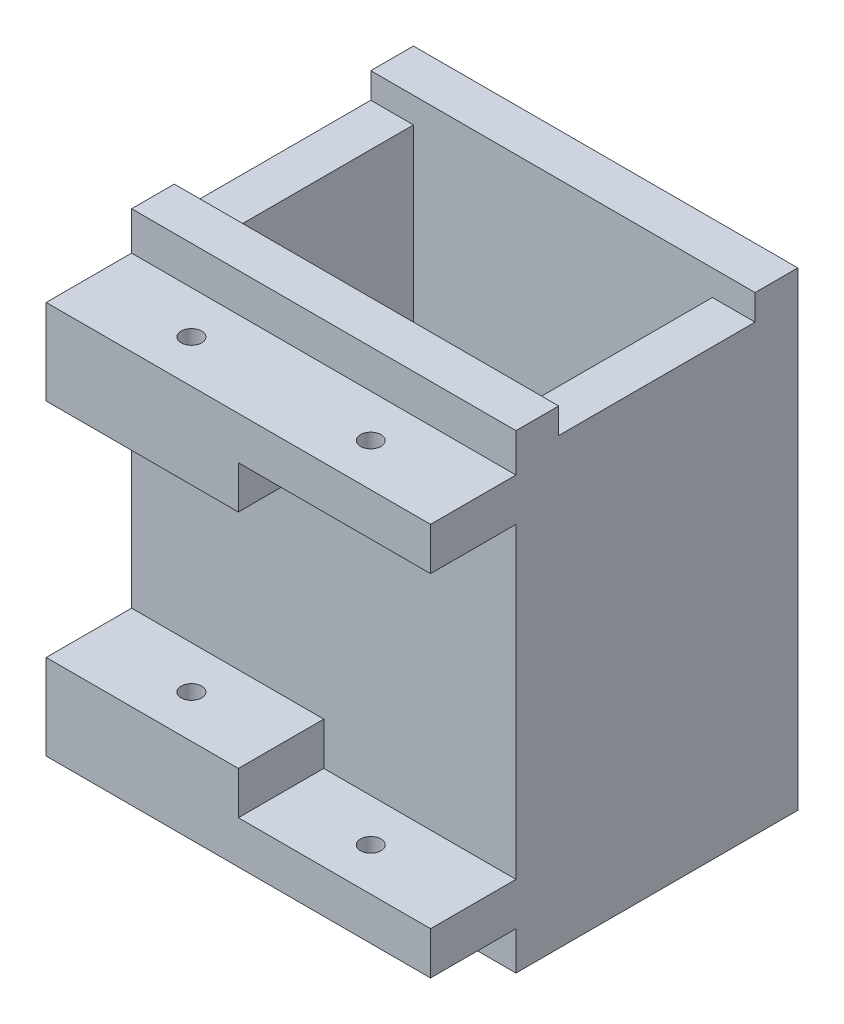
ISO-10303-21;
HEADER;
FILE_DESCRIPTION(('STEP AP214'),'2;1');
FILE_NAME('part.step','',(''),(''),'','','');
FILE_SCHEMA(('AUTOMOTIVE_DESIGN { 1 0 10303 214 1 1 1 1 }'));
ENDSEC;
DATA;
#1=APPLICATION_CONTEXT('core data for automotive mechanical design processes');
#2=APPLICATION_PROTOCOL_DEFINITION('international standard','automotive_design',2000,#1);
#3=PRODUCT_CONTEXT('',#1,'mechanical');
#4=PRODUCT('Part','Part','',(#3));
#5=PRODUCT_RELATED_PRODUCT_CATEGORY('part','',(#4));
#6=PRODUCT_DEFINITION_FORMATION('','',#4);
#7=PRODUCT_DEFINITION_CONTEXT('part definition',#1,'design');
#8=PRODUCT_DEFINITION('design','',#6,#7);
#9=PRODUCT_DEFINITION_SHAPE('','',#8);
#10=(LENGTH_UNIT() NAMED_UNIT(*) SI_UNIT(.MILLI.,.METRE.));
#11=(NAMED_UNIT(*) PLANE_ANGLE_UNIT() SI_UNIT($,.RADIAN.));
#12=(NAMED_UNIT(*) SI_UNIT($,.STERADIAN.) SOLID_ANGLE_UNIT());
#13=UNCERTAINTY_MEASURE_WITH_UNIT(LENGTH_MEASURE(1.E-05),#10,'distance_accuracy_value','');
#14=(GEOMETRIC_REPRESENTATION_CONTEXT(3) GLOBAL_UNCERTAINTY_ASSIGNED_CONTEXT((#13)) GLOBAL_UNIT_ASSIGNED_CONTEXT((#10,
#11,#12)) REPRESENTATION_CONTEXT('',''));
#15=CARTESIAN_POINT('',(0.,0.,0.));
#16=DIRECTION('',(0.,0.,1.));
#17=DIRECTION('',(1.,0.,0.));
#18=AXIS2_PLACEMENT_3D('',#15,#16,#17);
#19=CARTESIAN_POINT('',(-22.5,25.,43.));
#20=DIRECTION('',(0.,-1.,0.));
#21=DIRECTION('',(0.,0.,-1.));
#22=AXIS2_PLACEMENT_3D('',#19,#20,#21);
#23=PLANE('',#22);
#24=DIRECTION('',(0.,0.,-1.));
#25=VECTOR('',#24,1.);
#26=CARTESIAN_POINT('',(22.5,25.,43.));
#27=LINE('',#26,#25);
#28=CARTESIAN_POINT('',(22.5,25.,33.));
#29=VERTEX_POINT('',#28);
#30=CARTESIAN_POINT('',(22.5,25.,28.));
#31=VERTEX_POINT('',#30);
#32=EDGE_CURVE('E11',#29,#31,#27,.T.);
#33=ORIENTED_EDGE('',*,*,#32,.T.);
#34=DIRECTION('',(1.,0.,0.));
#35=VECTOR('',#34,1.);
#36=CARTESIAN_POINT('',(17.5,25.,28.));
#37=LINE('',#36,#35);
#38=CARTESIAN_POINT('',(-22.5,25.,28.));
#39=VERTEX_POINT('',#38);
#40=EDGE_CURVE('E368',#39,#31,#37,.T.);
#41=ORIENTED_EDGE('',*,*,#40,.F.);
#42=DIRECTION('',(0.,0.,-1.));
#43=VECTOR('',#42,1.);
#44=CARTESIAN_POINT('',(-22.5,25.,43.));
#45=LINE('',#44,#43);
#46=CARTESIAN_POINT('',(-22.5,25.,33.));
#47=VERTEX_POINT('',#46);
#48=EDGE_CURVE('E248',#47,#39,#45,.T.);
#49=ORIENTED_EDGE('',*,*,#48,.F.);
#50=DIRECTION('',(1.,0.,0.));
#51=VECTOR('',#50,1.);
#52=CARTESIAN_POINT('',(-22.5,25.,33.));
#53=LINE('',#52,#51);
#54=EDGE_CURVE('E298',#47,#29,#53,.T.);
#55=ORIENTED_EDGE('',*,*,#54,.T.);
#56=EDGE_LOOP('',(#33,#41,#49,#55));
#57=FACE_BOUND('',#56,.T.);
#58=ADVANCED_FACE('F39',(#57),#23,.F.);
#59=CARTESIAN_POINT('',(-22.5,20.5,43.));
#60=DIRECTION('',(0.,-1.,0.));
#61=DIRECTION('',(1.,0.,0.));
#62=AXIS2_PLACEMENT_3D('',#59,#60,#61);
#63=PLANE('',#62);
#64=CARTESIAN_POINT('',(-10.5,20.5,38.));
#65=DIRECTION('',(0.,1.,0.));
#66=DIRECTION('',(0.,0.,1.));
#67=AXIS2_PLACEMENT_3D('',#64,#65,#66);
#68=CIRCLE('',#67,1.19999999999999);
#69=CARTESIAN_POINT('',(-10.5,20.5,39.2));
#70=VERTEX_POINT('',#69);
#71=EDGE_CURVE('E259',#70,#70,#68,.T.);
#72=ORIENTED_EDGE('',*,*,#71,.F.);
#73=EDGE_LOOP('',(#72));
#74=FACE_BOUND('',#73,.T.);
#75=DIRECTION('',(0.,0.,-1.));
#76=VECTOR('',#75,1.);
#77=CARTESIAN_POINT('',(22.5,20.5,43.));
#78=LINE('',#77,#76);
#79=CARTESIAN_POINT('',(22.5,20.5,43.));
#80=VERTEX_POINT('',#79);
#81=CARTESIAN_POINT('',(22.5,20.5,33.));
#82=VERTEX_POINT('',#81);
#83=EDGE_CURVE('E305',#80,#82,#78,.T.);
#84=ORIENTED_EDGE('',*,*,#83,.T.);
#85=DIRECTION('',(1.,0.,0.));
#86=VECTOR('',#85,1.);
#87=CARTESIAN_POINT('',(-22.5,20.5,33.));
#88=LINE('',#87,#86);
#89=CARTESIAN_POINT('',(-22.5,20.5,33.));
#90=VERTEX_POINT('',#89);
#91=EDGE_CURVE('E320',#90,#82,#88,.T.);
#92=ORIENTED_EDGE('',*,*,#91,.F.);
#93=DIRECTION('',(0.,0.,-1.));
#94=VECTOR('',#93,1.);
#95=CARTESIAN_POINT('',(-22.5,20.5,43.));
#96=LINE('',#95,#94);
#97=CARTESIAN_POINT('',(-22.5,20.5,43.));
#98=VERTEX_POINT('',#97);
#99=EDGE_CURVE('E326',#98,#90,#96,.T.);
#100=ORIENTED_EDGE('',*,*,#99,.F.);
#101=DIRECTION('',(1.,0.,0.));
#102=VECTOR('',#101,1.);
#103=CARTESIAN_POINT('',(-22.5,20.5,43.));
#104=LINE('',#103,#102);
#105=EDGE_CURVE('E316',#98,#80,#104,.T.);
#106=ORIENTED_EDGE('',*,*,#105,.T.);
#107=EDGE_LOOP('',(#84,#92,#100,#106));
#108=FACE_BOUND('',#107,.T.);
#109=CARTESIAN_POINT('',(10.5,20.5,38.));
#110=DIRECTION('',(0.,1.,0.));
#111=DIRECTION('',(0.,0.,1.));
#112=AXIS2_PLACEMENT_3D('',#109,#110,#111);
#113=CIRCLE('',#112,1.19999999999999);
#114=CARTESIAN_POINT('',(10.5,20.5,39.2));
#115=VERTEX_POINT('',#114);
#116=EDGE_CURVE('E255',#115,#115,#113,.T.);
#117=ORIENTED_EDGE('',*,*,#116,.F.);
#118=EDGE_LOOP('',(#117));
#119=FACE_BOUND('',#118,.T.);
#120=ADVANCED_FACE('F477',(#74,#108,#119),#63,.F.);
#121=CARTESIAN_POINT('',(0.,0.,43.));
#122=DIRECTION('',(0.,0.,1.));
#123=DIRECTION('',(1.,0.,0.));
#124=AXIS2_PLACEMENT_3D('',#121,#122,#123);
#125=PLANE('',#124);
#126=DIRECTION('',(-1.,0.,0.));
#127=VECTOR('',#126,1.);
#128=CARTESIAN_POINT('',(22.5,15.5,43.));
#129=LINE('',#128,#127);
#130=CARTESIAN_POINT('',(22.5,15.5,43.));
#131=VERTEX_POINT('',#130);
#132=CARTESIAN_POINT('',(0.,15.5,43.));
#133=VERTEX_POINT('',#132);
#134=EDGE_CURVE('E281',#131,#133,#129,.T.);
#135=ORIENTED_EDGE('',*,*,#134,.F.);
#136=DIRECTION('',(0.,1.,0.));
#137=VECTOR('',#136,1.);
#138=CARTESIAN_POINT('',(22.5,25.,43.));
#139=LINE('',#138,#137);
#140=EDGE_CURVE('E230',#131,#80,#139,.T.);
#141=ORIENTED_EDGE('',*,*,#140,.T.);
#142=ORIENTED_EDGE('',*,*,#105,.F.);
#143=DIRECTION('',(0.,-1.,0.));
#144=VECTOR('',#143,1.);
#145=CARTESIAN_POINT('',(-22.5,25.,43.));
#146=LINE('',#145,#144);
#147=CARTESIAN_POINT('',(-22.5,10.5,43.));
#148=VERTEX_POINT('',#147);
#149=EDGE_CURVE('E232',#98,#148,#146,.T.);
#150=ORIENTED_EDGE('',*,*,#149,.T.);
#151=DIRECTION('',(1.,0.,0.));
#152=VECTOR('',#151,1.);
#153=CARTESIAN_POINT('',(-22.5,10.5,43.));
#154=LINE('',#153,#152);
#155=CARTESIAN_POINT('',(0.,10.5,43.));
#156=VERTEX_POINT('',#155);
#157=EDGE_CURVE('E344',#148,#156,#154,.T.);
#158=ORIENTED_EDGE('',*,*,#157,.T.);
#159=DIRECTION('',(0.,-1.,0.));
#160=VECTOR('',#159,1.);
#161=CARTESIAN_POINT('',(0.,15.5,43.));
#162=LINE('',#161,#160);
#163=EDGE_CURVE('E282',#133,#156,#162,.T.);
#164=ORIENTED_EDGE('',*,*,#163,.F.);
#165=EDGE_LOOP('',(#135,#141,#142,#150,#158,#164));
#166=FACE_BOUND('',#165,.T.);
#167=ADVANCED_FACE('F483',(#166),#125,.T.);
#168=CARTESIAN_POINT('',(22.5,25.,43.));
#169=DIRECTION('',(-1.,0.,0.));
#170=DIRECTION('',(0.,-1.,0.));
#171=AXIS2_PLACEMENT_3D('',#168,#169,#170);
#172=PLANE('',#171);
#173=DIRECTION('',(0.,1.,0.));
#174=VECTOR('',#173,1.);
#175=CARTESIAN_POINT('',(22.5,10.5,33.));
#176=LINE('',#175,#174);
#177=CARTESIAN_POINT('',(22.5,-20.5,33.));
#178=VERTEX_POINT('',#177);
#179=CARTESIAN_POINT('',(22.5,15.5,33.));
#180=VERTEX_POINT('',#179);
#181=EDGE_CURVE('E222',#178,#180,#176,.T.);
#182=ORIENTED_EDGE('',*,*,#181,.F.);
#183=DIRECTION('',(0.,0.,1.));
#184=VECTOR('',#183,1.);
#185=CARTESIAN_POINT('',(22.5,-20.5,9.95113885676778));
#186=LINE('',#185,#184);
#187=CARTESIAN_POINT('',(22.5,-20.5,43.));
#188=VERTEX_POINT('',#187);
#189=EDGE_CURVE('E207',#178,#188,#186,.T.);
#190=ORIENTED_EDGE('',*,*,#189,.T.);
#191=CARTESIAN_POINT('',(22.5,-25.5,43.));
#192=VERTEX_POINT('',#191);
#193=EDGE_CURVE('E220',#192,#188,#139,.T.);
#194=ORIENTED_EDGE('',*,*,#193,.F.);
#195=DIRECTION('',(0.,0.,1.));
#196=VECTOR('',#195,1.);
#197=CARTESIAN_POINT('',(22.5,-25.5,33.));
#198=LINE('',#197,#196);
#199=CARTESIAN_POINT('',(22.5,-25.5,33.));
#200=VERTEX_POINT('',#199);
#201=EDGE_CURVE('E306',#200,#192,#198,.T.);
#202=ORIENTED_EDGE('',*,*,#201,.F.);
#203=DIRECTION('',(0.,1.,0.));
#204=VECTOR('',#203,1.);
#205=CARTESIAN_POINT('',(22.5,-25.5,33.));
#206=LINE('',#205,#204);
#207=CARTESIAN_POINT('',(22.5,-30.,33.));
#208=VERTEX_POINT('',#207);
#209=EDGE_CURVE('E308',#208,#200,#206,.T.);
#210=ORIENTED_EDGE('',*,*,#209,.F.);
#211=DIRECTION('',(0.,0.,1.));
#212=VECTOR('',#211,1.);
#213=CARTESIAN_POINT('',(22.5,-30.,43.));
#214=LINE('',#213,#212);
#215=CARTESIAN_POINT('',(22.5,-30.,0.));
#216=VERTEX_POINT('',#215);
#217=EDGE_CURVE('E347',#216,#208,#214,.T.);
#218=ORIENTED_EDGE('',*,*,#217,.F.);
#219=DIRECTION('',(0.,1.,0.));
#220=VECTOR('',#219,1.);
#221=CARTESIAN_POINT('',(22.5,25.,0.));
#222=LINE('',#221,#220);
#223=CARTESIAN_POINT('',(22.5,25.,0.));
#224=VERTEX_POINT('',#223);
#225=EDGE_CURVE('E239',#216,#224,#222,.T.);
#226=ORIENTED_EDGE('',*,*,#225,.T.);
#227=CARTESIAN_POINT('',(22.5,25.,5.));
#228=VERTEX_POINT('',#227);
#229=EDGE_CURVE('E48',#228,#224,#27,.T.);
#230=ORIENTED_EDGE('',*,*,#229,.F.);
#231=DIRECTION('',(0.,1.,0.));
#232=VECTOR('',#231,1.);
#233=CARTESIAN_POINT('',(22.5,22.,5.));
#234=LINE('',#233,#232);
#235=CARTESIAN_POINT('',(22.5,22.,5.));
#236=VERTEX_POINT('',#235);
#237=EDGE_CURVE('E409',#236,#228,#234,.T.);
#238=ORIENTED_EDGE('',*,*,#237,.F.);
#239=DIRECTION('',(0.,0.,-1.));
#240=VECTOR('',#239,1.);
#241=CARTESIAN_POINT('',(22.5,22.,5.));
#242=LINE('',#241,#240);
#243=CARTESIAN_POINT('',(22.5,22.,28.));
#244=VERTEX_POINT('',#243);
#245=EDGE_CURVE('E429',#244,#236,#242,.T.);
#246=ORIENTED_EDGE('',*,*,#245,.F.);
#247=DIRECTION('',(0.,1.,0.));
#248=VECTOR('',#247,1.);
#249=CARTESIAN_POINT('',(22.5,22.,28.));
#250=LINE('',#249,#248);
#251=EDGE_CURVE('E405',#244,#31,#250,.T.);
#252=ORIENTED_EDGE('',*,*,#251,.T.);
#253=ORIENTED_EDGE('',*,*,#32,.F.);
#254=DIRECTION('',(0.,1.,0.));
#255=VECTOR('',#254,1.);
#256=CARTESIAN_POINT('',(22.5,25.,33.));
#257=LINE('',#256,#255);
#258=EDGE_CURVE('E324',#82,#29,#257,.T.);
#259=ORIENTED_EDGE('',*,*,#258,.F.);
#260=ORIENTED_EDGE('',*,*,#83,.F.);
#261=ORIENTED_EDGE('',*,*,#140,.F.);
#262=DIRECTION('',(0.,0.,1.));
#263=VECTOR('',#262,1.);
#264=CARTESIAN_POINT('',(22.5,15.5,9.95113885676778));
#265=LINE('',#264,#263);
#266=EDGE_CURVE('E295',#180,#131,#265,.T.);
#267=ORIENTED_EDGE('',*,*,#266,.F.);
#268=EDGE_LOOP('',(#182,#190,#194,#202,#210,#218,#226,#230,#238,#246,#252,#253,#259,#260,#261,#267));
#269=FACE_BOUND('',#268,.T.);
#270=ADVANCED_FACE('F41',(#269),#172,.F.);
#271=CARTESIAN_POINT('',(-22.5,25.,5.));
#272=VERTEX_POINT('',#271);
#273=CARTESIAN_POINT('',(-22.5,25.,0.));
#274=VERTEX_POINT('',#273);
#275=EDGE_CURVE('E250',#272,#274,#45,.T.);
#276=ORIENTED_EDGE('',*,*,#275,.F.);
#277=DIRECTION('',(-1.,0.,0.));
#278=VECTOR('',#277,1.);
#279=CARTESIAN_POINT('',(17.5,25.,5.));
#280=LINE('',#279,#278);
#281=EDGE_CURVE('E363',#228,#272,#280,.T.);
#282=ORIENTED_EDGE('',*,*,#281,.F.);
#283=ORIENTED_EDGE('',*,*,#229,.T.);
#284=DIRECTION('',(-1.,0.,0.));
#285=VECTOR('',#284,1.);
#286=CARTESIAN_POINT('',(-22.5,25.,0.));
#287=LINE('',#286,#285);
#288=EDGE_CURVE('E242',#224,#274,#287,.T.);
#289=ORIENTED_EDGE('',*,*,#288,.T.);
#290=EDGE_LOOP('',(#276,#282,#283,#289));
#291=FACE_BOUND('',#290,.T.);
#292=ADVANCED_FACE('F463',(#291),#23,.F.);
#293=CARTESIAN_POINT('',(-22.5,25.,43.));
#294=DIRECTION('',(1.,0.,0.));
#295=DIRECTION('',(0.,1.,0.));
#296=AXIS2_PLACEMENT_3D('',#293,#294,#295);
#297=PLANE('',#296);
#298=ORIENTED_EDGE('',*,*,#48,.T.);
#299=DIRECTION('',(0.,1.,0.));
#300=VECTOR('',#299,1.);
#301=CARTESIAN_POINT('',(-22.5,22.,28.));
#302=LINE('',#301,#300);
#303=CARTESIAN_POINT('',(-22.5,22.,28.));
#304=VERTEX_POINT('',#303);
#305=EDGE_CURVE('E414',#304,#39,#302,.T.);
#306=ORIENTED_EDGE('',*,*,#305,.F.);
#307=DIRECTION('',(0.,0.,1.));
#308=VECTOR('',#307,1.);
#309=CARTESIAN_POINT('',(-22.5,22.,5.));
#310=LINE('',#309,#308);
#311=CARTESIAN_POINT('',(-22.5,22.,5.));
#312=VERTEX_POINT('',#311);
#313=EDGE_CURVE('E407',#312,#304,#310,.T.);
#314=ORIENTED_EDGE('',*,*,#313,.F.);
#315=DIRECTION('',(0.,1.,0.));
#316=VECTOR('',#315,1.);
#317=CARTESIAN_POINT('',(-22.5,22.,5.));
#318=LINE('',#317,#316);
#319=EDGE_CURVE('E417',#312,#272,#318,.T.);
#320=ORIENTED_EDGE('',*,*,#319,.T.);
#321=ORIENTED_EDGE('',*,*,#275,.T.);
#322=DIRECTION('',(0.,-1.,0.));
#323=VECTOR('',#322,1.);
#324=CARTESIAN_POINT('',(-22.5,25.,0.));
#325=LINE('',#324,#323);
#326=CARTESIAN_POINT('',(-22.5,-30.,0.));
#327=VERTEX_POINT('',#326);
#328=EDGE_CURVE('E234',#274,#327,#325,.T.);
#329=ORIENTED_EDGE('',*,*,#328,.T.);
#330=DIRECTION('',(0.,0.,-1.));
#331=VECTOR('',#330,1.);
#332=CARTESIAN_POINT('',(-22.5,-30.,43.));
#333=LINE('',#332,#331);
#334=CARTESIAN_POINT('',(-22.5,-30.,33.));
#335=VERTEX_POINT('',#334);
#336=EDGE_CURVE('E358',#335,#327,#333,.T.);
#337=ORIENTED_EDGE('',*,*,#336,.F.);
#338=DIRECTION('',(0.,1.,0.));
#339=VECTOR('',#338,1.);
#340=CARTESIAN_POINT('',(-22.5,-25.5,33.));
#341=LINE('',#340,#339);
#342=CARTESIAN_POINT('',(-22.5,-25.5,33.));
#343=VERTEX_POINT('',#342);
#344=EDGE_CURVE('E309',#335,#343,#341,.T.);
#345=ORIENTED_EDGE('',*,*,#344,.T.);
#346=DIRECTION('',(0.,0.,1.));
#347=VECTOR('',#346,1.);
#348=CARTESIAN_POINT('',(-22.5,-25.5,33.));
#349=LINE('',#348,#347);
#350=CARTESIAN_POINT('',(-22.5,-25.5,43.));
#351=VERTEX_POINT('',#350);
#352=EDGE_CURVE('E301',#343,#351,#349,.T.);
#353=ORIENTED_EDGE('',*,*,#352,.T.);
#354=CARTESIAN_POINT('',(-22.5,-15.5,43.));
#355=VERTEX_POINT('',#354);
#356=EDGE_CURVE('E229',#355,#351,#146,.T.);
#357=ORIENTED_EDGE('',*,*,#356,.F.);
#358=DIRECTION('',(0.,0.,-1.));
#359=VECTOR('',#358,1.);
#360=CARTESIAN_POINT('',(-22.5,-15.5,43.));
#361=LINE('',#360,#359);
#362=CARTESIAN_POINT('',(-22.5,-15.5,33.));
#363=VERTEX_POINT('',#362);
#364=EDGE_CURVE('E333',#355,#363,#361,.T.);
#365=ORIENTED_EDGE('',*,*,#364,.T.);
#366=DIRECTION('',(0.,1.,0.));
#367=VECTOR('',#366,1.);
#368=CARTESIAN_POINT('',(-22.5,10.5,33.));
#369=LINE('',#368,#367);
#370=CARTESIAN_POINT('',(-22.5,10.5,33.));
#371=VERTEX_POINT('',#370);
#372=EDGE_CURVE('E336',#363,#371,#369,.T.);
#373=ORIENTED_EDGE('',*,*,#372,.T.);
#374=DIRECTION('',(0.,0.,1.));
#375=VECTOR('',#374,1.);
#376=CARTESIAN_POINT('',(-22.5,10.5,43.));
#377=LINE('',#376,#375);
#378=EDGE_CURVE('E339',#371,#148,#377,.T.);
#379=ORIENTED_EDGE('',*,*,#378,.T.);
#380=ORIENTED_EDGE('',*,*,#149,.F.);
#381=ORIENTED_EDGE('',*,*,#99,.T.);
#382=DIRECTION('',(0.,1.,0.));
#383=VECTOR('',#382,1.);
#384=CARTESIAN_POINT('',(-22.5,25.,33.));
#385=LINE('',#384,#383);
#386=EDGE_CURVE('E319',#90,#47,#385,.T.);
#387=ORIENTED_EDGE('',*,*,#386,.T.);
#388=EDGE_LOOP('',(#298,#306,#314,#320,#321,#329,#337,#345,#353,#357,#365,#373,#379,#380,#381,#387));
#389=FACE_BOUND('',#388,.T.);
#390=ADVANCED_FACE('F443',(#389),#297,.F.);
#391=DIRECTION('',(0.,-1.,0.));
#392=VECTOR('',#391,1.);
#393=CARTESIAN_POINT('',(0.,-15.5,43.));
#394=LINE('',#393,#392);
#395=CARTESIAN_POINT('',(0.,-15.5,43.));
#396=VERTEX_POINT('',#395);
#397=CARTESIAN_POINT('',(0.,-20.5,43.));
#398=VERTEX_POINT('',#397);
#399=EDGE_CURVE('E215',#396,#398,#394,.T.);
#400=ORIENTED_EDGE('',*,*,#399,.F.);
#401=DIRECTION('',(1.,0.,0.));
#402=VECTOR('',#401,1.);
#403=CARTESIAN_POINT('',(-22.5,-15.5,43.));
#404=LINE('',#403,#402);
#405=EDGE_CURVE('E342',#355,#396,#404,.T.);
#406=ORIENTED_EDGE('',*,*,#405,.F.);
#407=ORIENTED_EDGE('',*,*,#356,.T.);
#408=DIRECTION('',(1.,0.,0.));
#409=VECTOR('',#408,1.);
#410=CARTESIAN_POINT('',(-22.5,-25.5,43.));
#411=LINE('',#410,#409);
#412=EDGE_CURVE('E228',#351,#192,#411,.T.);
#413=ORIENTED_EDGE('',*,*,#412,.T.);
#414=ORIENTED_EDGE('',*,*,#193,.T.);
#415=DIRECTION('',(1.,0.,0.));
#416=VECTOR('',#415,1.);
#417=CARTESIAN_POINT('',(22.5,-20.5,43.));
#418=LINE('',#417,#416);
#419=EDGE_CURVE('E203',#398,#188,#418,.T.);
#420=ORIENTED_EDGE('',*,*,#419,.F.);
#421=EDGE_LOOP('',(#400,#406,#407,#413,#414,#420));
#422=FACE_BOUND('',#421,.T.);
#423=ADVANCED_FACE('F226',(#422),#125,.T.);
#424=CARTESIAN_POINT('',(0.,0.,0.));
#425=DIRECTION('',(0.,0.,1.));
#426=DIRECTION('',(1.,0.,0.));
#427=AXIS2_PLACEMENT_3D('',#424,#425,#426);
#428=PLANE('',#427);
#429=ORIENTED_EDGE('',*,*,#225,.F.);
#430=DIRECTION('',(1.,0.,0.));
#431=VECTOR('',#430,1.);
#432=CARTESIAN_POINT('',(22.5,-30.,0.));
#433=LINE('',#432,#431);
#434=EDGE_CURVE('E360',#327,#216,#433,.T.);
#435=ORIENTED_EDGE('',*,*,#434,.F.);
#436=ORIENTED_EDGE('',*,*,#328,.F.);
#437=ORIENTED_EDGE('',*,*,#288,.F.);
#438=EDGE_LOOP('',(#429,#435,#436,#437));
#439=FACE_BOUND('',#438,.T.);
#440=ADVANCED_FACE('F457',(#439),#428,.F.);
#441=CARTESIAN_POINT('',(17.5,-25.,5.));
#442=DIRECTION('',(1.,0.,0.));
#443=DIRECTION('',(0.,0.,-1.));
#444=AXIS2_PLACEMENT_3D('',#441,#442,#443);
#445=PLANE('',#444);
#446=DIRECTION('',(0.,1.,0.));
#447=VECTOR('',#446,1.);
#448=CARTESIAN_POINT('',(17.5,-25.,28.));
#449=LINE('',#448,#447);
#450=CARTESIAN_POINT('',(17.5,-25.,28.));
#451=VERTEX_POINT('',#450);
#452=CARTESIAN_POINT('',(17.5,22.,28.));
#453=VERTEX_POINT('',#452);
#454=EDGE_CURVE('E243',#451,#453,#449,.T.);
#455=ORIENTED_EDGE('',*,*,#454,.T.);
#456=DIRECTION('',(0.,0.,-1.));
#457=VECTOR('',#456,1.);
#458=CARTESIAN_POINT('',(17.5,22.,5.));
#459=LINE('',#458,#457);
#460=CARTESIAN_POINT('',(17.5,22.,5.));
#461=VERTEX_POINT('',#460);
#462=EDGE_CURVE('E266',#453,#461,#459,.T.);
#463=ORIENTED_EDGE('',*,*,#462,.T.);
#464=DIRECTION('',(0.,1.,0.));
#465=VECTOR('',#464,1.);
#466=CARTESIAN_POINT('',(17.5,-25.,5.));
#467=LINE('',#466,#465);
#468=CARTESIAN_POINT('',(17.5,-25.,5.));
#469=VERTEX_POINT('',#468);
#470=EDGE_CURVE('E236',#469,#461,#467,.T.);
#471=ORIENTED_EDGE('',*,*,#470,.F.);
#472=DIRECTION('',(0.,0.,-1.));
#473=VECTOR('',#472,1.);
#474=CARTESIAN_POINT('',(17.5,-25.,5.));
#475=LINE('',#474,#473);
#476=EDGE_CURVE('E364',#451,#469,#475,.T.);
#477=ORIENTED_EDGE('',*,*,#476,.F.);
#478=EDGE_LOOP('',(#455,#463,#471,#477));
#479=FACE_BOUND('',#478,.T.);
#480=ADVANCED_FACE('F396',(#479),#445,.F.);
#481=CARTESIAN_POINT('',(17.5,-25.,28.));
#482=DIRECTION('',(0.,0.,1.));
#483=DIRECTION('',(1.,0.,0.));
#484=AXIS2_PLACEMENT_3D('',#481,#482,#483);
#485=PLANE('',#484);
#486=DIRECTION('',(0.,1.,0.));
#487=VECTOR('',#486,1.);
#488=CARTESIAN_POINT('',(-17.5,-25.,28.));
#489=LINE('',#488,#487);
#490=CARTESIAN_POINT('',(-17.5,-25.,28.));
#491=VERTEX_POINT('',#490);
#492=CARTESIAN_POINT('',(-17.5,22.,28.));
#493=VERTEX_POINT('',#492);
#494=EDGE_CURVE('E381',#491,#493,#489,.T.);
#495=ORIENTED_EDGE('',*,*,#494,.T.);
#496=DIRECTION('',(1.,0.,0.));
#497=VECTOR('',#496,1.);
#498=CARTESIAN_POINT('',(22.5,22.,28.));
#499=LINE('',#498,#497);
#500=EDGE_CURVE('E64',#304,#493,#499,.T.);
#501=ORIENTED_EDGE('',*,*,#500,.F.);
#502=ORIENTED_EDGE('',*,*,#305,.T.);
#503=ORIENTED_EDGE('',*,*,#40,.T.);
#504=ORIENTED_EDGE('',*,*,#251,.F.);
#505=EDGE_CURVE('E400',#453,#244,#499,.T.);
#506=ORIENTED_EDGE('',*,*,#505,.F.);
#507=ORIENTED_EDGE('',*,*,#454,.F.);
#508=DIRECTION('',(1.,0.,0.));
#509=VECTOR('',#508,1.);
#510=CARTESIAN_POINT('',(17.5,-25.,28.));
#511=LINE('',#510,#509);
#512=EDGE_CURVE('E374',#491,#451,#511,.T.);
#513=ORIENTED_EDGE('',*,*,#512,.F.);
#514=EDGE_LOOP('',(#495,#501,#502,#503,#504,#506,#507,#513));
#515=FACE_BOUND('',#514,.T.);
#516=ADVANCED_FACE('F403',(#515),#485,.F.);
#517=CARTESIAN_POINT('',(-17.5,-25.,5.));
#518=DIRECTION('',(-1.,0.,0.));
#519=DIRECTION('',(0.,0.,1.));
#520=AXIS2_PLACEMENT_3D('',#517,#518,#519);
#521=PLANE('',#520);
#522=DIRECTION('',(0.,1.,0.));
#523=VECTOR('',#522,1.);
#524=CARTESIAN_POINT('',(-17.5,-25.,5.));
#525=LINE('',#524,#523);
#526=CARTESIAN_POINT('',(-17.5,-25.,5.));
#527=VERTEX_POINT('',#526);
#528=CARTESIAN_POINT('',(-17.5,22.,5.));
#529=VERTEX_POINT('',#528);
#530=EDGE_CURVE('E383',#527,#529,#525,.T.);
#531=ORIENTED_EDGE('',*,*,#530,.T.);
#532=DIRECTION('',(0.,0.,1.));
#533=VECTOR('',#532,1.);
#534=CARTESIAN_POINT('',(-17.5,22.,5.));
#535=LINE('',#534,#533);
#536=EDGE_CURVE('E271',#529,#493,#535,.T.);
#537=ORIENTED_EDGE('',*,*,#536,.T.);
#538=ORIENTED_EDGE('',*,*,#494,.F.);
#539=DIRECTION('',(0.,0.,1.));
#540=VECTOR('',#539,1.);
#541=CARTESIAN_POINT('',(-17.5,-25.,5.));
#542=LINE('',#541,#540);
#543=EDGE_CURVE('E371',#527,#491,#542,.T.);
#544=ORIENTED_EDGE('',*,*,#543,.F.);
#545=EDGE_LOOP('',(#531,#537,#538,#544));
#546=FACE_BOUND('',#545,.T.);
#547=ADVANCED_FACE('F421',(#546),#521,.F.);
#548=CARTESIAN_POINT('',(17.5,-25.,5.));
#549=DIRECTION('',(0.,0.,-1.));
#550=DIRECTION('',(-1.,0.,0.));
#551=AXIS2_PLACEMENT_3D('',#548,#549,#550);
#552=PLANE('',#551);
#553=ORIENTED_EDGE('',*,*,#470,.T.);
#554=DIRECTION('',(-1.,0.,0.));
#555=VECTOR('',#554,1.);
#556=CARTESIAN_POINT('',(22.5,22.,5.));
#557=LINE('',#556,#555);
#558=EDGE_CURVE('E392',#236,#461,#557,.T.);
#559=ORIENTED_EDGE('',*,*,#558,.F.);
#560=ORIENTED_EDGE('',*,*,#237,.T.);
#561=ORIENTED_EDGE('',*,*,#281,.T.);
#562=ORIENTED_EDGE('',*,*,#319,.F.);
#563=EDGE_CURVE('E427',#529,#312,#557,.T.);
#564=ORIENTED_EDGE('',*,*,#563,.F.);
#565=ORIENTED_EDGE('',*,*,#530,.F.);
#566=DIRECTION('',(-1.,0.,0.));
#567=VECTOR('',#566,1.);
#568=CARTESIAN_POINT('',(17.5,-25.,5.));
#569=LINE('',#568,#567);
#570=EDGE_CURVE('E367',#469,#527,#569,.T.);
#571=ORIENTED_EDGE('',*,*,#570,.F.);
#572=EDGE_LOOP('',(#553,#559,#560,#561,#562,#564,#565,#571));
#573=FACE_BOUND('',#572,.T.);
#574=ADVANCED_FACE('F390',(#573),#552,.F.);
#575=CARTESIAN_POINT('',(0.,-25.,0.));
#576=DIRECTION('',(0.,1.,0.));
#577=DIRECTION('',(0.,0.,1.));
#578=AXIS2_PLACEMENT_3D('',#575,#576,#577);
#579=PLANE('',#578);
#580=ORIENTED_EDGE('',*,*,#543,.T.);
#581=ORIENTED_EDGE('',*,*,#512,.T.);
#582=ORIENTED_EDGE('',*,*,#476,.T.);
#583=ORIENTED_EDGE('',*,*,#570,.T.);
#584=EDGE_LOOP('',(#580,#581,#582,#583));
#585=FACE_BOUND('',#584,.T.);
#586=ADVANCED_FACE('F425',(#585),#579,.T.);
#587=CARTESIAN_POINT('',(0.,-30.,0.));
#588=DIRECTION('',(0.,1.,0.));
#589=DIRECTION('',(0.,0.,1.));
#590=AXIS2_PLACEMENT_3D('',#587,#588,#589);
#591=PLANE('',#590);
#592=ORIENTED_EDGE('',*,*,#217,.T.);
#593=DIRECTION('',(1.,0.,0.));
#594=VECTOR('',#593,1.);
#595=CARTESIAN_POINT('',(-22.5,-30.,33.));
#596=LINE('',#595,#594);
#597=EDGE_CURVE('E303',#335,#208,#596,.T.);
#598=ORIENTED_EDGE('',*,*,#597,.F.);
#599=ORIENTED_EDGE('',*,*,#336,.T.);
#600=ORIENTED_EDGE('',*,*,#434,.T.);
#601=EDGE_LOOP('',(#592,#598,#599,#600));
#602=FACE_BOUND('',#601,.T.);
#603=ADVANCED_FACE('F453',(#602),#591,.F.);
#604=CARTESIAN_POINT('',(-22.5,-25.5,33.));
#605=DIRECTION('',(0.,0.,-1.));
#606=DIRECTION('',(-1.,0.,0.));
#607=AXIS2_PLACEMENT_3D('',#604,#605,#606);
#608=PLANE('',#607);
#609=ORIENTED_EDGE('',*,*,#209,.T.);
#610=DIRECTION('',(1.,0.,0.));
#611=VECTOR('',#610,1.);
#612=CARTESIAN_POINT('',(-22.5,-25.5,33.));
#613=LINE('',#612,#611);
#614=EDGE_CURVE('E299',#343,#200,#613,.T.);
#615=ORIENTED_EDGE('',*,*,#614,.F.);
#616=ORIENTED_EDGE('',*,*,#344,.F.);
#617=ORIENTED_EDGE('',*,*,#597,.T.);
#618=EDGE_LOOP('',(#609,#615,#616,#617));
#619=FACE_BOUND('',#618,.T.);
#620=ADVANCED_FACE('F523',(#619),#608,.F.);
#621=CARTESIAN_POINT('',(-22.5,-25.5,33.));
#622=DIRECTION('',(0.,1.,0.));
#623=DIRECTION('',(-1.,0.,0.));
#624=AXIS2_PLACEMENT_3D('',#621,#622,#623);
#625=PLANE('',#624);
#626=CARTESIAN_POINT('',(-10.5,-25.5,38.));
#627=DIRECTION('',(0.,1.,0.));
#628=DIRECTION('',(-1.,0.,0.));
#629=AXIS2_PLACEMENT_3D('',#626,#627,#628);
#630=CIRCLE('',#629,1.19999999999999);
#631=CARTESIAN_POINT('',(-10.5,-25.5,39.2));
#632=VERTEX_POINT('',#631);
#633=EDGE_CURVE('E256',#632,#632,#630,.T.);
#634=ORIENTED_EDGE('',*,*,#633,.T.);
#635=EDGE_LOOP('',(#634));
#636=FACE_BOUND('',#635,.T.);
#637=CARTESIAN_POINT('',(10.5,-25.5,38.));
#638=DIRECTION('',(0.,1.,0.));
#639=DIRECTION('',(-1.,0.,0.));
#640=AXIS2_PLACEMENT_3D('',#637,#638,#639);
#641=CIRCLE('',#640,1.19999999999999);
#642=CARTESIAN_POINT('',(9.30000000000001,-25.5,38.));
#643=VERTEX_POINT('',#642);
#644=EDGE_CURVE('E254',#643,#643,#641,.T.);
#645=ORIENTED_EDGE('',*,*,#644,.T.);
#646=EDGE_LOOP('',(#645));
#647=FACE_BOUND('',#646,.T.);
#648=ORIENTED_EDGE('',*,*,#201,.T.);
#649=ORIENTED_EDGE('',*,*,#412,.F.);
#650=ORIENTED_EDGE('',*,*,#352,.F.);
#651=ORIENTED_EDGE('',*,*,#614,.T.);
#652=EDGE_LOOP('',(#648,#649,#650,#651));
#653=FACE_BOUND('',#652,.T.);
#654=ADVANCED_FACE('F447',(#636,#647,#653),#625,.F.);
#655=CARTESIAN_POINT('',(-22.5,10.5,43.));
#656=DIRECTION('',(0.,1.,0.));
#657=DIRECTION('',(-1.,0.,0.));
#658=AXIS2_PLACEMENT_3D('',#655,#656,#657);
#659=PLANE('',#658);
#660=CARTESIAN_POINT('',(-10.5,10.5,38.));
#661=DIRECTION('',(0.,1.,0.));
#662=DIRECTION('',(-1.,0.,0.));
#663=AXIS2_PLACEMENT_3D('',#660,#661,#662);
#664=CIRCLE('',#663,1.19999999999999);
#665=CARTESIAN_POINT('',(-11.7,10.5,38.));
#666=VERTEX_POINT('',#665);
#667=EDGE_CURVE('E263',#666,#666,#664,.T.);
#668=ORIENTED_EDGE('',*,*,#667,.T.);
#669=EDGE_LOOP('',(#668));
#670=FACE_BOUND('',#669,.T.);
#671=DIRECTION('',(1.,0.,0.));
#672=VECTOR('',#671,1.);
#673=CARTESIAN_POINT('',(-22.5,10.5,33.));
#674=LINE('',#673,#672);
#675=CARTESIAN_POINT('',(0.,10.5,33.));
#676=VERTEX_POINT('',#675);
#677=EDGE_CURVE('E348',#371,#676,#674,.T.);
#678=ORIENTED_EDGE('',*,*,#677,.T.);
#679=DIRECTION('',(0.,0.,1.));
#680=VECTOR('',#679,1.);
#681=CARTESIAN_POINT('',(0.,10.5,9.95113885676778));
#682=LINE('',#681,#680);
#683=EDGE_CURVE('E292',#676,#156,#682,.T.);
#684=ORIENTED_EDGE('',*,*,#683,.T.);
#685=ORIENTED_EDGE('',*,*,#157,.F.);
#686=ORIENTED_EDGE('',*,*,#378,.F.);
#687=EDGE_LOOP('',(#678,#684,#685,#686));
#688=FACE_BOUND('',#687,.T.);
#689=ADVANCED_FACE('F530',(#670,#688),#659,.F.);
#690=CARTESIAN_POINT('',(-22.5,10.5,33.));
#691=DIRECTION('',(0.,0.,-1.));
#692=DIRECTION('',(-1.,0.,0.));
#693=AXIS2_PLACEMENT_3D('',#690,#691,#692);
#694=PLANE('',#693);
#695=ORIENTED_EDGE('',*,*,#181,.T.);
#696=DIRECTION('',(-1.,0.,0.));
#697=VECTOR('',#696,1.);
#698=CARTESIAN_POINT('',(22.5,15.5,33.));
#699=LINE('',#698,#697);
#700=CARTESIAN_POINT('',(0.,15.5,33.));
#701=VERTEX_POINT('',#700);
#702=EDGE_CURVE('E284',#180,#701,#699,.T.);
#703=ORIENTED_EDGE('',*,*,#702,.T.);
#704=DIRECTION('',(0.,-1.,0.));
#705=VECTOR('',#704,1.);
#706=CARTESIAN_POINT('',(0.,15.5,33.));
#707=LINE('',#706,#705);
#708=EDGE_CURVE('E290',#701,#676,#707,.T.);
#709=ORIENTED_EDGE('',*,*,#708,.T.);
#710=ORIENTED_EDGE('',*,*,#677,.F.);
#711=ORIENTED_EDGE('',*,*,#372,.F.);
#712=DIRECTION('',(1.,0.,0.));
#713=VECTOR('',#712,1.);
#714=CARTESIAN_POINT('',(-22.5,-15.5,33.));
#715=LINE('',#714,#713);
#716=CARTESIAN_POINT('',(0.,-15.5,33.));
#717=VERTEX_POINT('',#716);
#718=EDGE_CURVE('E351',#363,#717,#715,.T.);
#719=ORIENTED_EDGE('',*,*,#718,.T.);
#720=DIRECTION('',(0.,-1.,0.));
#721=VECTOR('',#720,1.);
#722=CARTESIAN_POINT('',(0.,-15.5,33.));
#723=LINE('',#722,#721);
#724=CARTESIAN_POINT('',(0.,-20.5,33.));
#725=VERTEX_POINT('',#724);
#726=EDGE_CURVE('E56',#717,#725,#723,.T.);
#727=ORIENTED_EDGE('',*,*,#726,.T.);
#728=DIRECTION('',(1.,0.,0.));
#729=VECTOR('',#728,1.);
#730=CARTESIAN_POINT('',(22.5,-20.5,33.));
#731=LINE('',#730,#729);
#732=EDGE_CURVE('E223',#725,#178,#731,.T.);
#733=ORIENTED_EDGE('',*,*,#732,.T.);
#734=EDGE_LOOP('',(#695,#703,#709,#710,#711,#719,#727,#733));
#735=FACE_BOUND('',#734,.T.);
#736=ADVANCED_FACE('F527',(#735),#694,.F.);
#737=CARTESIAN_POINT('',(-22.5,-15.5,43.));
#738=DIRECTION('',(0.,-1.,0.));
#739=DIRECTION('',(1.,0.,0.));
#740=AXIS2_PLACEMENT_3D('',#737,#738,#739);
#741=PLANE('',#740);
#742=CARTESIAN_POINT('',(-10.5,-15.5,38.));
#743=DIRECTION('',(0.,-1.,0.));
#744=DIRECTION('',(1.,0.,0.));
#745=AXIS2_PLACEMENT_3D('',#742,#743,#744);
#746=CIRCLE('',#745,1.19999999999999);
#747=CARTESIAN_POINT('',(-10.5,-15.5,39.2));
#748=VERTEX_POINT('',#747);
#749=EDGE_CURVE('E258',#748,#748,#746,.T.);
#750=ORIENTED_EDGE('',*,*,#749,.T.);
#751=EDGE_LOOP('',(#750));
#752=FACE_BOUND('',#751,.T.);
#753=ORIENTED_EDGE('',*,*,#405,.T.);
#754=DIRECTION('',(0.,0.,1.));
#755=VECTOR('',#754,1.);
#756=CARTESIAN_POINT('',(0.,-15.5,9.95113885676778));
#757=LINE('',#756,#755);
#758=EDGE_CURVE('E214',#717,#396,#757,.T.);
#759=ORIENTED_EDGE('',*,*,#758,.F.);
#760=ORIENTED_EDGE('',*,*,#718,.F.);
#761=ORIENTED_EDGE('',*,*,#364,.F.);
#762=EDGE_LOOP('',(#753,#759,#760,#761));
#763=FACE_BOUND('',#762,.T.);
#764=ADVANCED_FACE('F440',(#752,#763),#741,.F.);
#765=CARTESIAN_POINT('',(-22.5,25.,33.));
#766=DIRECTION('',(0.,0.,-1.));
#767=DIRECTION('',(-1.,0.,0.));
#768=AXIS2_PLACEMENT_3D('',#765,#766,#767);
#769=PLANE('',#768);
#770=ORIENTED_EDGE('',*,*,#258,.T.);
#771=ORIENTED_EDGE('',*,*,#54,.F.);
#772=ORIENTED_EDGE('',*,*,#386,.F.);
#773=ORIENTED_EDGE('',*,*,#91,.T.);
#774=EDGE_LOOP('',(#770,#771,#772,#773));
#775=FACE_BOUND('',#774,.T.);
#776=ADVANCED_FACE('F526',(#775),#769,.F.);
#777=CARTESIAN_POINT('',(22.5,15.5,9.95113885676778));
#778=DIRECTION('',(0.,1.,0.));
#779=DIRECTION('',(-1.,0.,0.));
#780=AXIS2_PLACEMENT_3D('',#777,#778,#779);
#781=PLANE('',#780);
#782=CARTESIAN_POINT('',(10.5,15.5,38.));
#783=DIRECTION('',(0.,1.,0.));
#784=DIRECTION('',(-1.,0.,0.));
#785=AXIS2_PLACEMENT_3D('',#782,#783,#784);
#786=CIRCLE('',#785,1.19999999999999);
#787=CARTESIAN_POINT('',(9.30000000000001,15.5,38.));
#788=VERTEX_POINT('',#787);
#789=EDGE_CURVE('E252',#788,#788,#786,.T.);
#790=ORIENTED_EDGE('',*,*,#789,.T.);
#791=EDGE_LOOP('',(#790));
#792=FACE_BOUND('',#791,.T.);
#793=ORIENTED_EDGE('',*,*,#266,.T.);
#794=ORIENTED_EDGE('',*,*,#134,.T.);
#795=DIRECTION('',(0.,0.,1.));
#796=VECTOR('',#795,1.);
#797=CARTESIAN_POINT('',(0.,15.5,9.95113885676778));
#798=LINE('',#797,#796);
#799=EDGE_CURVE('E289',#701,#133,#798,.T.);
#800=ORIENTED_EDGE('',*,*,#799,.F.);
#801=ORIENTED_EDGE('',*,*,#702,.F.);
#802=EDGE_LOOP('',(#793,#794,#800,#801));
#803=FACE_BOUND('',#802,.T.);
#804=ADVANCED_FACE('F535',(#792,#803),#781,.F.);
#805=CARTESIAN_POINT('',(0.,15.5,9.95113885676778));
#806=DIRECTION('',(-1.,0.,0.));
#807=DIRECTION('',(0.,0.,1.));
#808=AXIS2_PLACEMENT_3D('',#805,#806,#807);
#809=PLANE('',#808);
#810=ORIENTED_EDGE('',*,*,#799,.T.);
#811=ORIENTED_EDGE('',*,*,#163,.T.);
#812=ORIENTED_EDGE('',*,*,#683,.F.);
#813=ORIENTED_EDGE('',*,*,#708,.F.);
#814=EDGE_LOOP('',(#810,#811,#812,#813));
#815=FACE_BOUND('',#814,.T.);
#816=ADVANCED_FACE('F544',(#815),#809,.F.);
#817=CARTESIAN_POINT('',(10.5,20.5,38.));
#818=DIRECTION('',(0.,1.,0.));
#819=DIRECTION('',(0.,0.,1.));
#820=AXIS2_PLACEMENT_3D('',#817,#818,#819);
#821=CYLINDRICAL_SURFACE('',#820,1.19999999999999);
#822=ORIENTED_EDGE('',*,*,#116,.T.);
#823=EDGE_LOOP('',(#822));
#824=FACE_BOUND('',#823,.T.);
#825=ORIENTED_EDGE('',*,*,#789,.F.);
#826=EDGE_LOOP('',(#825));
#827=FACE_BOUND('',#826,.T.);
#828=ADVANCED_FACE('F547',(#824,#827),#821,.F.);
#829=CARTESIAN_POINT('',(10.5,-20.5,38.));
#830=DIRECTION('',(0.,-1.,0.));
#831=DIRECTION('',(0.,0.,-1.));
#832=AXIS2_PLACEMENT_3D('',#829,#830,#831);
#833=CIRCLE('',#832,1.19999999999999);
#834=CARTESIAN_POINT('',(10.5,-20.5,36.8));
#835=VERTEX_POINT('',#834);
#836=EDGE_CURVE('E43',#835,#835,#833,.F.);
#837=ORIENTED_EDGE('',*,*,#836,.T.);
#838=EDGE_LOOP('',(#837));
#839=FACE_BOUND('',#838,.T.);
#840=ORIENTED_EDGE('',*,*,#644,.F.);
#841=EDGE_LOOP('',(#840));
#842=FACE_BOUND('',#841,.T.);
#843=ADVANCED_FACE('F549',(#839,#842),#821,.F.);
#844=CARTESIAN_POINT('',(-10.5,20.5,38.));
#845=DIRECTION('',(0.,1.,0.));
#846=DIRECTION('',(0.,0.,1.));
#847=AXIS2_PLACEMENT_3D('',#844,#845,#846);
#848=CYLINDRICAL_SURFACE('',#847,1.19999999999999);
#849=CARTESIAN_POINT('',(-10.5,-25.5,39.2));
#850=CARTESIAN_POINT('',(-10.5,-25.3958333333333,39.2));
#851=CARTESIAN_POINT('',(-10.5,-25.2916666666667,39.2));
#852=CARTESIAN_POINT('',(-10.5,-25.0833333333333,39.2));
#853=CARTESIAN_POINT('',(-10.5,-24.9791666666667,39.2));
#854=CARTESIAN_POINT('',(-10.5,-24.7708333333333,39.2));
#855=CARTESIAN_POINT('',(-10.5,-24.6666666666667,39.2));
#856=CARTESIAN_POINT('',(-10.5,-24.4583333333333,39.2));
#857=CARTESIAN_POINT('',(-10.5,-24.3541666666667,39.2));
#858=CARTESIAN_POINT('',(-10.5,-24.1458333333333,39.2));
#859=CARTESIAN_POINT('',(-10.5,-24.0416666666667,39.2));
#860=CARTESIAN_POINT('',(-10.5,-23.8333333333333,39.2));
#861=CARTESIAN_POINT('',(-10.5,-23.7291666666667,39.2));
#862=CARTESIAN_POINT('',(-10.5,-23.5208333333333,39.2));
#863=CARTESIAN_POINT('',(-10.5,-23.4166666666667,39.2));
#864=CARTESIAN_POINT('',(-10.5,-23.2083333333333,39.2));
#865=CARTESIAN_POINT('',(-10.5,-23.1041666666667,39.2));
#866=CARTESIAN_POINT('',(-10.5,-22.8958333333333,39.2));
#867=CARTESIAN_POINT('',(-10.5,-22.7916666666667,39.2));
#868=CARTESIAN_POINT('',(-10.5,-22.5833333333333,39.2));
#869=CARTESIAN_POINT('',(-10.5,-22.4791666666667,39.2));
#870=CARTESIAN_POINT('',(-10.5,-22.2708333333333,39.2));
#871=CARTESIAN_POINT('',(-10.5,-22.1666666666667,39.2));
#872=CARTESIAN_POINT('',(-10.5,-21.9583333333333,39.2));
#873=CARTESIAN_POINT('',(-10.5,-21.8541666666667,39.2));
#874=CARTESIAN_POINT('',(-10.5,-21.6458333333333,39.2));
#875=CARTESIAN_POINT('',(-10.5,-21.5416666666667,39.2));
#876=CARTESIAN_POINT('',(-10.5,-21.3333333333333,39.2));
#877=CARTESIAN_POINT('',(-10.5,-21.2291666666667,39.2));
#878=CARTESIAN_POINT('',(-10.5,-21.0208333333333,39.2));
#879=CARTESIAN_POINT('',(-10.5,-20.9166666666667,39.2));
#880=CARTESIAN_POINT('',(-10.5,-20.7083333333333,39.2));
#881=CARTESIAN_POINT('',(-10.5,-20.6041666666667,39.2));
#882=CARTESIAN_POINT('',(-10.5,-20.3958333333333,39.2));
#883=CARTESIAN_POINT('',(-10.5,-20.2916666666667,39.2));
#884=CARTESIAN_POINT('',(-10.5,-20.0833333333333,39.2));
#885=CARTESIAN_POINT('',(-10.5,-19.9791666666667,39.2));
#886=CARTESIAN_POINT('',(-10.5,-19.7708333333333,39.2));
#887=CARTESIAN_POINT('',(-10.5,-19.6666666666667,39.2));
#888=CARTESIAN_POINT('',(-10.5,-19.4583333333333,39.2));
#889=CARTESIAN_POINT('',(-10.5,-19.3541666666667,39.2));
#890=CARTESIAN_POINT('',(-10.5,-19.1458333333333,39.2));
#891=CARTESIAN_POINT('',(-10.5,-19.0416666666667,39.2));
#892=CARTESIAN_POINT('',(-10.5,-18.8333333333333,39.2));
#893=CARTESIAN_POINT('',(-10.5,-18.7291666666667,39.2));
#894=CARTESIAN_POINT('',(-10.5,-18.5208333333333,39.2));
#895=CARTESIAN_POINT('',(-10.5,-18.4166666666667,39.2));
#896=CARTESIAN_POINT('',(-10.5,-18.2083333333333,39.2));
#897=CARTESIAN_POINT('',(-10.5,-18.1041666666667,39.2));
#898=CARTESIAN_POINT('',(-10.5,-17.8958333333333,39.2));
#899=CARTESIAN_POINT('',(-10.5,-17.7916666666667,39.2));
#900=CARTESIAN_POINT('',(-10.5,-17.5833333333333,39.2));
#901=CARTESIAN_POINT('',(-10.5,-17.4791666666667,39.2));
#902=CARTESIAN_POINT('',(-10.5,-17.2708333333333,39.2));
#903=CARTESIAN_POINT('',(-10.5,-17.1666666666667,39.2));
#904=CARTESIAN_POINT('',(-10.5,-16.9583333333333,39.2));
#905=CARTESIAN_POINT('',(-10.5,-16.8541666666667,39.2));
#906=CARTESIAN_POINT('',(-10.5,-16.6458333333333,39.2));
#907=CARTESIAN_POINT('',(-10.5,-16.5416666666667,39.2));
#908=CARTESIAN_POINT('',(-10.5,-16.3333333333333,39.2));
#909=CARTESIAN_POINT('',(-10.5,-16.2291666666667,39.2));
#910=CARTESIAN_POINT('',(-10.5,-16.0208333333333,39.2));
#911=CARTESIAN_POINT('',(-10.5,-15.9166666666667,39.2));
#912=CARTESIAN_POINT('',(-10.5,-15.7083333333333,39.2));
#913=CARTESIAN_POINT('',(-10.5,-15.6041666666667,39.2));
#914=CARTESIAN_POINT('',(-10.5,-15.5,39.2));
#915=B_SPLINE_CURVE_WITH_KNOTS('',3,(#849,#850,#851,#852,#853,#854,#855,#856,#857,#858,#859,
#860,#861,#862,#863,#864,#865,#866,#867,#868,#869,#870,#871,#872,#873,#874,#875,#876,#877,#878,
#879,#880,#881,#882,#883,#884,#885,#886,#887,#888,#889,#890,#891,#892,#893,#894,#895,#896,#897,
#898,#899,#900,#901,#902,#903,#904,#905,#906,#907,#908,#909,#910,#911,#912,#913,#914),
.UNSPECIFIED.,.F.,.F.,(4,2,2,2,2,2,2,2,2,2,2,2,2,2,2,2,2,2,2,2,2,2,2,2,2,2,2,2,2,2,2,2,4),(0.,
0.3125,0.625000000000001,0.937500000000001,1.25,1.5625,1.875,2.1875,2.5,2.8125,3.125,3.4375,
3.75,4.0625,4.375,4.6875,5.,5.3125,5.625,5.9375,6.25,6.5625,6.875,7.1875,7.49999999999999,
7.8125,8.12499999999999,8.43749999999999,8.74999999999999,9.06249999999999,9.37499999999999,
9.68749999999999,9.99999999999999),.UNSPECIFIED.);
#916=EDGE_CURVE('BSEAM473',#632,#748,#915,.T.);
#917=ORIENTED_EDGE('',*,*,#633,.F.);
#918=ORIENTED_EDGE('',*,*,#749,.F.);
#919=ORIENTED_EDGE('',*,*,#916,.T.);
#920=ORIENTED_EDGE('',*,*,#916,.F.);
#921=EDGE_LOOP('',(#917,#919,#918,#920));
#922=FACE_BOUND('',#921,.T.);
#923=ADVANCED_FACE('F473',(#922),#848,.F.);
#924=ORIENTED_EDGE('',*,*,#71,.T.);
#925=EDGE_LOOP('',(#924));
#926=FACE_BOUND('',#925,.T.);
#927=ORIENTED_EDGE('',*,*,#667,.F.);
#928=EDGE_LOOP('',(#927));
#929=FACE_BOUND('',#928,.T.);
#930=ADVANCED_FACE('F466',(#926,#929),#848,.F.);
#931=CARTESIAN_POINT('',(0.,22.,0.));
#932=DIRECTION('',(0.,-1.,0.));
#933=DIRECTION('',(0.,0.,-1.));
#934=AXIS2_PLACEMENT_3D('',#931,#932,#933);
#935=PLANE('',#934);
#936=ORIENTED_EDGE('',*,*,#563,.T.);
#937=ORIENTED_EDGE('',*,*,#313,.T.);
#938=ORIENTED_EDGE('',*,*,#500,.T.);
#939=ORIENTED_EDGE('',*,*,#536,.F.);
#940=EDGE_LOOP('',(#936,#937,#938,#939));
#941=FACE_BOUND('',#940,.T.);
#942=ADVANCED_FACE('F464',(#941),#935,.F.);
#943=ORIENTED_EDGE('',*,*,#505,.T.);
#944=ORIENTED_EDGE('',*,*,#245,.T.);
#945=ORIENTED_EDGE('',*,*,#558,.T.);
#946=ORIENTED_EDGE('',*,*,#462,.F.);
#947=EDGE_LOOP('',(#943,#944,#945,#946));
#948=FACE_BOUND('',#947,.T.);
#949=ADVANCED_FACE('F399',(#948),#935,.F.);
#950=CARTESIAN_POINT('',(22.5,-20.5,9.95113885676778));
#951=DIRECTION('',(0.,-1.,0.));
#952=DIRECTION('',(0.,0.,-1.));
#953=AXIS2_PLACEMENT_3D('',#950,#951,#952);
#954=PLANE('',#953);
#955=DIRECTION('',(0.,0.,1.));
#956=VECTOR('',#955,1.);
#957=CARTESIAN_POINT('',(0.,-20.5,9.95113885676778));
#958=LINE('',#957,#956);
#959=EDGE_CURVE('E209',#725,#398,#958,.T.);
#960=ORIENTED_EDGE('',*,*,#959,.T.);
#961=ORIENTED_EDGE('',*,*,#419,.T.);
#962=ORIENTED_EDGE('',*,*,#189,.F.);
#963=ORIENTED_EDGE('',*,*,#732,.F.);
#964=EDGE_LOOP('',(#960,#961,#962,#963));
#965=FACE_BOUND('',#964,.T.);
#966=ORIENTED_EDGE('',*,*,#836,.F.);
#967=EDGE_LOOP('',(#966));
#968=FACE_BOUND('',#967,.T.);
#969=ADVANCED_FACE('F205',(#965,#968),#954,.F.);
#970=CARTESIAN_POINT('',(0.,-15.5,9.95113885676778));
#971=DIRECTION('',(-1.,0.,0.));
#972=DIRECTION('',(0.,0.,1.));
#973=AXIS2_PLACEMENT_3D('',#970,#971,#972);
#974=PLANE('',#973);
#975=ORIENTED_EDGE('',*,*,#758,.T.);
#976=ORIENTED_EDGE('',*,*,#399,.T.);
#977=ORIENTED_EDGE('',*,*,#959,.F.);
#978=ORIENTED_EDGE('',*,*,#726,.F.);
#979=EDGE_LOOP('',(#975,#976,#977,#978));
#980=FACE_BOUND('',#979,.T.);
#981=ADVANCED_FACE('F436',(#980),#974,.F.);
#982=CLOSED_SHELL('',(#58,#120,#167,#270,#292,#390,#423,#440,#480,#516,#547,#574,#586,#603,#620,
#654,#689,#736,#764,#776,#804,#816,#828,#843,#923,#930,#942,#949,#969,#981));
#983=MANIFOLD_SOLID_BREP('B2',#982);
#984=ADVANCED_BREP_SHAPE_REPRESENTATION('',(#18,#983),#14);
#985=SHAPE_DEFINITION_REPRESENTATION(#9,#984);
ENDSEC;
END-ISO-10303-21;
